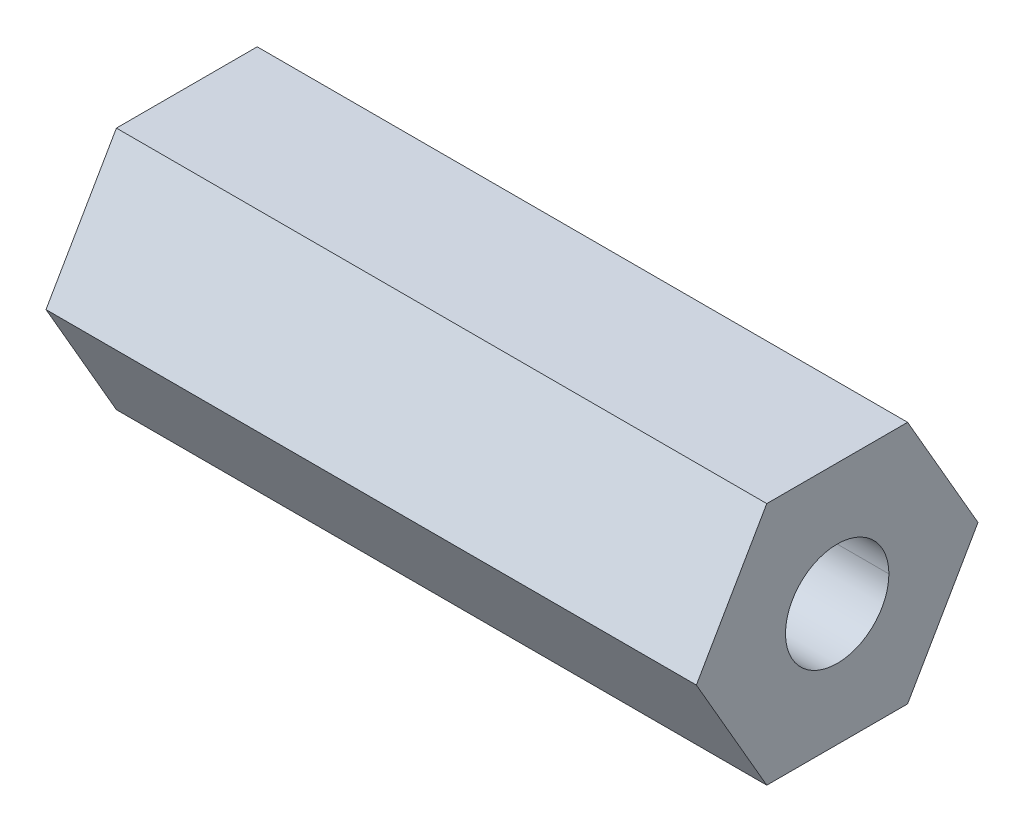
ISO-10303-21;
HEADER;
FILE_DESCRIPTION(('STEP AP214'),'2;1');
FILE_NAME('part.step','',(''),(''),'','','');
FILE_SCHEMA(('AUTOMOTIVE_DESIGN { 1 0 10303 214 1 1 1 1 }'));
ENDSEC;
DATA;
#1=APPLICATION_CONTEXT('core data for automotive mechanical design processes');
#2=APPLICATION_PROTOCOL_DEFINITION('international standard','automotive_design',2000,#1);
#3=PRODUCT_CONTEXT('',#1,'mechanical');
#4=PRODUCT('Part','Part','',(#3));
#5=PRODUCT_RELATED_PRODUCT_CATEGORY('part','',(#4));
#6=PRODUCT_DEFINITION_FORMATION('','',#4);
#7=PRODUCT_DEFINITION_CONTEXT('part definition',#1,'design');
#8=PRODUCT_DEFINITION('design','',#6,#7);
#9=PRODUCT_DEFINITION_SHAPE('','',#8);
#10=(LENGTH_UNIT() NAMED_UNIT(*) SI_UNIT(.MILLI.,.METRE.));
#11=(NAMED_UNIT(*) PLANE_ANGLE_UNIT() SI_UNIT($,.RADIAN.));
#12=(NAMED_UNIT(*) SI_UNIT($,.STERADIAN.) SOLID_ANGLE_UNIT());
#13=UNCERTAINTY_MEASURE_WITH_UNIT(LENGTH_MEASURE(1.E-05),#10,'distance_accuracy_value','');
#14=(GEOMETRIC_REPRESENTATION_CONTEXT(3) GLOBAL_UNCERTAINTY_ASSIGNED_CONTEXT((#13)) GLOBAL_UNIT_ASSIGNED_CONTEXT((#10,
#11,#12)) REPRESENTATION_CONTEXT('',''));
#15=CARTESIAN_POINT('',(0.,0.,0.));
#16=DIRECTION('',(0.,0.,1.));
#17=DIRECTION('',(1.,0.,0.));
#18=AXIS2_PLACEMENT_3D('',#15,#16,#17);
#19=CARTESIAN_POINT('',(38.1,0.,0.));
#20=DIRECTION('',(1.,0.,0.));
#21=DIRECTION('',(0.,0.,-1.));
#22=AXIS2_PLACEMENT_3D('',#19,#20,#21);
#23=CYLINDRICAL_SURFACE('',#22,2.0193);
#24=DIRECTION('',(1.,0.,0.));
#25=VECTOR('',#24,1.);
#26=CARTESIAN_POINT('',(38.1,0.,2.0193));
#27=LINE('',#26,#25);
#28=CARTESIAN_POINT('',(12.7,0.,2.0193));
#29=VERTEX_POINT('',#28);
#30=CARTESIAN_POINT('',(38.1,0.,2.0193));
#31=VERTEX_POINT('',#30);
#32=EDGE_CURVE('E166',#29,#31,#27,.T.);
#33=ORIENTED_EDGE('',*,*,#32,.F.);
#34=CARTESIAN_POINT('',(12.7,0.,0.));
#35=DIRECTION('',(1.,0.,0.));
#36=DIRECTION('',(0.,0.,-1.));
#37=AXIS2_PLACEMENT_3D('',#34,#35,#36);
#38=CIRCLE('',#37,2.0193);
#39=CARTESIAN_POINT('',(12.7,0.,-2.0193));
#40=VERTEX_POINT('',#39);
#41=EDGE_CURVE('E65',#29,#40,#38,.F.);
#42=ORIENTED_EDGE('',*,*,#41,.T.);
#43=DIRECTION('',(1.,0.,0.));
#44=VECTOR('',#43,1.);
#45=CARTESIAN_POINT('',(38.1,0.,-2.0193));
#46=LINE('',#45,#44);
#47=CARTESIAN_POINT('',(38.1,0.,-2.0193));
#48=VERTEX_POINT('',#47);
#49=EDGE_CURVE('E182',#40,#48,#46,.T.);
#50=ORIENTED_EDGE('',*,*,#49,.T.);
#51=CARTESIAN_POINT('',(38.1,0.,0.));
#52=DIRECTION('',(1.,0.,0.));
#53=DIRECTION('',(0.,0.,-1.));
#54=AXIS2_PLACEMENT_3D('',#51,#52,#53);
#55=CIRCLE('',#54,2.0193);
#56=EDGE_CURVE('E51',#48,#31,#55,.T.);
#57=ORIENTED_EDGE('',*,*,#56,.T.);
#58=EDGE_LOOP('',(#33,#42,#50,#57));
#59=FACE_BOUND('',#58,.T.);
#60=ADVANCED_FACE('F43',(#59),#23,.F.);
#61=CARTESIAN_POINT('',(38.1,0.,0.));
#62=DIRECTION('',(1.,0.,0.));
#63=DIRECTION('',(0.,1.,0.));
#64=AXIS2_PLACEMENT_3D('',#61,#62,#63);
#65=PLANE('',#64);
#66=ORIENTED_EDGE('',*,*,#56,.F.);
#67=CARTESIAN_POINT('',(38.1,0.,0.));
#68=DIRECTION('',(1.,0.,0.));
#69=DIRECTION('',(0.,0.,-1.));
#70=AXIS2_PLACEMENT_3D('',#67,#68,#69);
#71=CIRCLE('',#70,2.0193);
#72=EDGE_CURVE('E169',#31,#48,#71,.T.);
#73=ORIENTED_EDGE('',*,*,#72,.F.);
#74=EDGE_LOOP('',(#66,#73));
#75=FACE_BOUND('',#74,.T.);
#76=DIRECTION('',(0.,0.866025403784442,-0.5));
#77=VECTOR('',#76,1.);
#78=CARTESIAN_POINT('',(38.1,-4.7625,-2.74963065701564));
#79=LINE('',#78,#77);
#80=CARTESIAN_POINT('',(38.1,-4.7625,-2.74963065701564));
#81=VERTEX_POINT('',#80);
#82=CARTESIAN_POINT('',(38.1,0.,-5.49926131403117));
#83=VERTEX_POINT('',#82);
#84=EDGE_CURVE('E174',#81,#83,#79,.T.);
#85=ORIENTED_EDGE('',*,*,#84,.T.);
#86=DIRECTION('',(0.,0.866025403784438,0.5));
#87=VECTOR('',#86,1.);
#88=CARTESIAN_POINT('',(38.1,0.,-5.49926131403117));
#89=LINE('',#88,#87);
#90=CARTESIAN_POINT('',(38.1,4.7625,-2.74963065701557));
#91=VERTEX_POINT('',#90);
#92=EDGE_CURVE('E139',#83,#91,#89,.T.);
#93=ORIENTED_EDGE('',*,*,#92,.T.);
#94=DIRECTION('',(0.,0.,1.));
#95=VECTOR('',#94,1.);
#96=CARTESIAN_POINT('',(38.1,4.7625,-2.74963065701557));
#97=LINE('',#96,#95);
#98=CARTESIAN_POINT('',(38.1,4.7625,2.7496306570156));
#99=VERTEX_POINT('',#98);
#100=EDGE_CURVE('E138',#91,#99,#97,.T.);
#101=ORIENTED_EDGE('',*,*,#100,.T.);
#102=DIRECTION('',(0.,-0.866025403784442,0.5));
#103=VECTOR('',#102,1.);
#104=CARTESIAN_POINT('',(38.1,4.7625,2.7496306570156));
#105=LINE('',#104,#103);
#106=CARTESIAN_POINT('',(38.1,0.,5.49926131403117));
#107=VERTEX_POINT('',#106);
#108=EDGE_CURVE('E135',#99,#107,#105,.T.);
#109=ORIENTED_EDGE('',*,*,#108,.T.);
#110=DIRECTION('',(0.,-0.866025403784435,-0.500000000000007));
#111=VECTOR('',#110,1.);
#112=CARTESIAN_POINT('',(38.1,0.,5.49926131403117));
#113=LINE('',#112,#111);
#114=CARTESIAN_POINT('',(38.1,-4.7625,2.74963065701554));
#115=VERTEX_POINT('',#114);
#116=EDGE_CURVE('E165',#107,#115,#113,.T.);
#117=ORIENTED_EDGE('',*,*,#116,.T.);
#118=DIRECTION('',(0.,0.,-1.));
#119=VECTOR('',#118,1.);
#120=CARTESIAN_POINT('',(38.1,-4.7625,2.74963065701554));
#121=LINE('',#120,#119);
#122=EDGE_CURVE('E160',#115,#81,#121,.T.);
#123=ORIENTED_EDGE('',*,*,#122,.T.);
#124=EDGE_LOOP('',(#85,#93,#101,#109,#117,#123));
#125=FACE_BOUND('',#124,.T.);
#126=ADVANCED_FACE('F218',(#75,#125),#65,.T.);
#127=CARTESIAN_POINT('',(38.1,-4.7625,2.74963065701554));
#128=DIRECTION('',(0.,1.,0.));
#129=DIRECTION('',(0.,0.,-1.));
#130=AXIS2_PLACEMENT_3D('',#127,#128,#129);
#131=PLANE('',#130);
#132=DIRECTION('',(-1.,0.,0.));
#133=VECTOR('',#132,1.);
#134=CARTESIAN_POINT('',(38.1,-4.7625,2.74963065701554));
#135=LINE('',#134,#133);
#136=CARTESIAN_POINT('',(12.7,-4.76250000000003,2.74963065701553));
#137=VERTEX_POINT('',#136);
#138=EDGE_CURVE('E161',#115,#137,#135,.T.);
#139=ORIENTED_EDGE('',*,*,#138,.T.);
#140=DIRECTION('',(0.,0.,-1.));
#141=VECTOR('',#140,1.);
#142=CARTESIAN_POINT('',(12.7,-4.7625,-5.49926131403119));
#143=LINE('',#142,#141);
#144=CARTESIAN_POINT('',(12.7,-4.76250000000001,-2.74963065701564));
#145=VERTEX_POINT('',#144);
#146=EDGE_CURVE('E131',#137,#145,#143,.T.);
#147=ORIENTED_EDGE('',*,*,#146,.T.);
#148=DIRECTION('',(-1.,0.,0.));
#149=VECTOR('',#148,1.);
#150=CARTESIAN_POINT('',(38.1,-4.7625,-2.74963065701564));
#151=LINE('',#150,#149);
#152=EDGE_CURVE('E156',#81,#145,#151,.T.);
#153=ORIENTED_EDGE('',*,*,#152,.F.);
#154=ORIENTED_EDGE('',*,*,#122,.F.);
#155=EDGE_LOOP('',(#139,#147,#153,#154));
#156=FACE_BOUND('',#155,.T.);
#157=ADVANCED_FACE('F210',(#156),#131,.F.);
#158=CARTESIAN_POINT('',(38.1,0.,5.49926131403117));
#159=DIRECTION('',(0.,0.500000000000007,-0.866025403784435));
#160=DIRECTION('',(-1.,0.,0.));
#161=AXIS2_PLACEMENT_3D('',#158,#159,#160);
#162=PLANE('',#161);
#163=DIRECTION('',(-1.,0.,0.));
#164=VECTOR('',#163,1.);
#165=CARTESIAN_POINT('',(38.1,0.,5.49926131403117));
#166=LINE('',#165,#164);
#167=CARTESIAN_POINT('',(12.7,0.,5.49926131403117));
#168=VERTEX_POINT('',#167);
#169=EDGE_CURVE('E146',#107,#168,#166,.T.);
#170=ORIENTED_EDGE('',*,*,#169,.T.);
#171=DIRECTION('',(0.,-0.866025403784435,-0.500000000000007));
#172=VECTOR('',#171,1.);
#173=CARTESIAN_POINT('',(12.7,0.,5.49926131403117));
#174=LINE('',#173,#172);
#175=EDGE_CURVE('E118',#168,#137,#174,.T.);
#176=ORIENTED_EDGE('',*,*,#175,.T.);
#177=ORIENTED_EDGE('',*,*,#138,.F.);
#178=ORIENTED_EDGE('',*,*,#116,.F.);
#179=EDGE_LOOP('',(#170,#176,#177,#178));
#180=FACE_BOUND('',#179,.T.);
#181=ADVANCED_FACE('F45',(#180),#162,.F.);
#182=CARTESIAN_POINT('',(38.1,4.7625,2.7496306570156));
#183=DIRECTION('',(0.,-0.5,-0.866025403784442));
#184=DIRECTION('',(0.,-0.866025403784442,0.5));
#185=AXIS2_PLACEMENT_3D('',#182,#183,#184);
#186=PLANE('',#185);
#187=DIRECTION('',(-1.,0.,0.));
#188=VECTOR('',#187,1.);
#189=CARTESIAN_POINT('',(38.1,4.7625,2.7496306570156));
#190=LINE('',#189,#188);
#191=CARTESIAN_POINT('',(12.7,4.76249999999998,2.7496306570156));
#192=VERTEX_POINT('',#191);
#193=EDGE_CURVE('E128',#99,#192,#190,.T.);
#194=ORIENTED_EDGE('',*,*,#193,.T.);
#195=DIRECTION('',(0.,-0.866025403784439,0.499999999999999));
#196=VECTOR('',#195,1.);
#197=CARTESIAN_POINT('',(12.7,4.7625,2.7496306570156));
#198=LINE('',#197,#196);
#199=EDGE_CURVE('E113',#192,#168,#198,.T.);
#200=ORIENTED_EDGE('',*,*,#199,.T.);
#201=ORIENTED_EDGE('',*,*,#169,.F.);
#202=ORIENTED_EDGE('',*,*,#108,.F.);
#203=EDGE_LOOP('',(#194,#200,#201,#202));
#204=FACE_BOUND('',#203,.T.);
#205=ADVANCED_FACE('F133',(#204),#186,.F.);
#206=CARTESIAN_POINT('',(38.1,4.7625,-2.74963065701557));
#207=DIRECTION('',(0.,-1.,0.));
#208=DIRECTION('',(0.,0.,-1.));
#209=AXIS2_PLACEMENT_3D('',#206,#207,#208);
#210=PLANE('',#209);
#211=DIRECTION('',(-1.,0.,0.));
#212=VECTOR('',#211,1.);
#213=CARTESIAN_POINT('',(38.1,4.7625,-2.74963065701557));
#214=LINE('',#213,#212);
#215=CARTESIAN_POINT('',(12.7,4.7625,-2.74963065701558));
#216=VERTEX_POINT('',#215);
#217=EDGE_CURVE('E130',#91,#216,#214,.T.);
#218=ORIENTED_EDGE('',*,*,#217,.T.);
#219=DIRECTION('',(0.,0.,-1.));
#220=VECTOR('',#219,1.);
#221=CARTESIAN_POINT('',(12.7,4.76250000000001,-5.49926131403115));
#222=LINE('',#221,#220);
#223=EDGE_CURVE('E116',#192,#216,#222,.T.);
#224=ORIENTED_EDGE('',*,*,#223,.F.);
#225=ORIENTED_EDGE('',*,*,#193,.F.);
#226=ORIENTED_EDGE('',*,*,#100,.F.);
#227=EDGE_LOOP('',(#218,#224,#225,#226));
#228=FACE_BOUND('',#227,.T.);
#229=ADVANCED_FACE('F127',(#228),#210,.F.);
#230=CARTESIAN_POINT('',(38.1,0.,-5.49926131403117));
#231=DIRECTION('',(0.,-0.5,0.866025403784438));
#232=DIRECTION('',(-1.,0.,0.));
#233=AXIS2_PLACEMENT_3D('',#230,#231,#232);
#234=PLANE('',#233);
#235=DIRECTION('',(-1.,0.,0.));
#236=VECTOR('',#235,1.);
#237=CARTESIAN_POINT('',(38.1,0.,-5.49926131403117));
#238=LINE('',#237,#236);
#239=CARTESIAN_POINT('',(12.7,0.,-5.49926131403117));
#240=VERTEX_POINT('',#239);
#241=EDGE_CURVE('E153',#83,#240,#238,.T.);
#242=ORIENTED_EDGE('',*,*,#241,.T.);
#243=DIRECTION('',(0.,0.866025403784438,0.5));
#244=VECTOR('',#243,1.);
#245=CARTESIAN_POINT('',(12.7,0.,-5.49926131403117));
#246=LINE('',#245,#244);
#247=EDGE_CURVE('E58',#240,#216,#246,.T.);
#248=ORIENTED_EDGE('',*,*,#247,.T.);
#249=ORIENTED_EDGE('',*,*,#217,.F.);
#250=ORIENTED_EDGE('',*,*,#92,.F.);
#251=EDGE_LOOP('',(#242,#248,#249,#250));
#252=FACE_BOUND('',#251,.T.);
#253=ADVANCED_FACE('F220',(#252),#234,.F.);
#254=CARTESIAN_POINT('',(38.1,-4.7625,-2.74963065701564));
#255=DIRECTION('',(0.,0.5,0.866025403784442));
#256=DIRECTION('',(1.,0.,0.));
#257=AXIS2_PLACEMENT_3D('',#254,#255,#256);
#258=PLANE('',#257);
#259=ORIENTED_EDGE('',*,*,#152,.T.);
#260=DIRECTION('',(0.,0.866025403784439,-0.499999999999999));
#261=VECTOR('',#260,1.);
#262=CARTESIAN_POINT('',(12.7,-4.7625,-2.74963065701564));
#263=LINE('',#262,#261);
#264=EDGE_CURVE('E207',#145,#240,#263,.T.);
#265=ORIENTED_EDGE('',*,*,#264,.T.);
#266=ORIENTED_EDGE('',*,*,#241,.F.);
#267=ORIENTED_EDGE('',*,*,#84,.F.);
#268=EDGE_LOOP('',(#259,#265,#266,#267));
#269=FACE_BOUND('',#268,.T.);
#270=ADVANCED_FACE('F205',(#269),#258,.F.);
#271=CARTESIAN_POINT('',(38.1,0.,0.));
#272=DIRECTION('',(1.,0.,0.));
#273=DIRECTION('',(0.,0.,-1.));
#274=AXIS2_PLACEMENT_3D('',#271,#272,#273);
#275=CYLINDRICAL_SURFACE('',#274,2.0193);
#276=ORIENTED_EDGE('',*,*,#49,.F.);
#277=CARTESIAN_POINT('',(12.7,0.,0.));
#278=DIRECTION('',(1.,0.,0.));
#279=DIRECTION('',(0.,0.,-1.));
#280=AXIS2_PLACEMENT_3D('',#277,#278,#279);
#281=CIRCLE('',#280,2.0193);
#282=EDGE_CURVE('E11',#40,#29,#281,.F.);
#283=ORIENTED_EDGE('',*,*,#282,.T.);
#284=ORIENTED_EDGE('',*,*,#32,.T.);
#285=ORIENTED_EDGE('',*,*,#72,.T.);
#286=EDGE_LOOP('',(#276,#283,#284,#285));
#287=FACE_BOUND('',#286,.T.);
#288=ADVANCED_FACE('F227',(#287),#275,.F.);
#289=CARTESIAN_POINT('',(12.7,-4.7625,-5.49926131403119));
#290=DIRECTION('',(1.,0.,0.));
#291=DIRECTION('',(0.,0.,-1.));
#292=AXIS2_PLACEMENT_3D('',#289,#290,#291);
#293=PLANE('',#292);
#294=ORIENTED_EDGE('',*,*,#282,.F.);
#295=ORIENTED_EDGE('',*,*,#41,.F.);
#296=EDGE_LOOP('',(#294,#295));
#297=FACE_BOUND('',#296,.T.);
#298=ORIENTED_EDGE('',*,*,#199,.F.);
#299=ORIENTED_EDGE('',*,*,#223,.T.);
#300=ORIENTED_EDGE('',*,*,#247,.F.);
#301=ORIENTED_EDGE('',*,*,#264,.F.);
#302=ORIENTED_EDGE('',*,*,#146,.F.);
#303=ORIENTED_EDGE('',*,*,#175,.F.);
#304=EDGE_LOOP('',(#298,#299,#300,#301,#302,#303));
#305=FACE_BOUND('',#304,.T.);
#306=ADVANCED_FACE('F115',(#297,#305),#293,.F.);
#307=CLOSED_SHELL('',(#60,#126,#157,#181,#205,#229,#253,#270,#288,#306));
#308=MANIFOLD_SOLID_BREP('B2',#307);
#309=ADVANCED_BREP_SHAPE_REPRESENTATION('',(#18,#308),#14);
#310=SHAPE_DEFINITION_REPRESENTATION(#9,#309);
ENDSEC;
END-ISO-10303-21;
